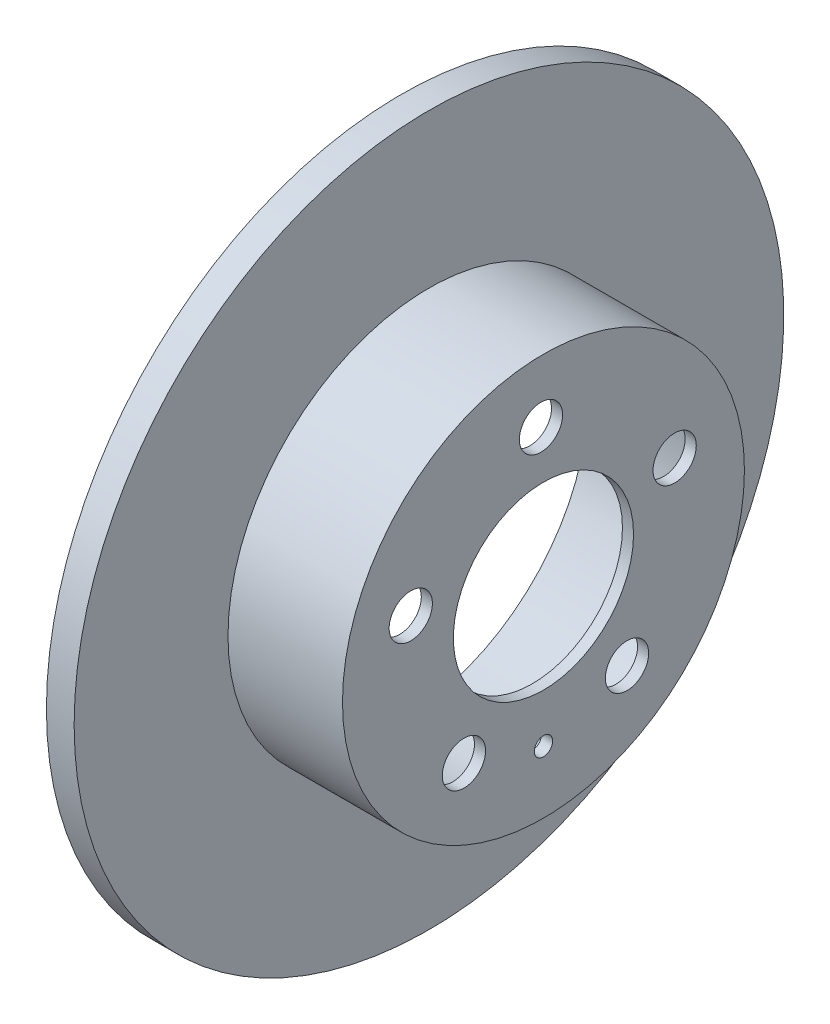
ISO-10303-21;
HEADER;
FILE_DESCRIPTION(('STEP AP214'),'2;1');
FILE_NAME('part.step','',(''),(''),'','','');
FILE_SCHEMA(('AUTOMOTIVE_DESIGN { 1 0 10303 214 1 1 1 1 }'));
ENDSEC;
DATA;
#1=APPLICATION_CONTEXT('core data for automotive mechanical design processes');
#2=APPLICATION_PROTOCOL_DEFINITION('international standard','automotive_design',2000,#1);
#3=PRODUCT_CONTEXT('',#1,'mechanical');
#4=PRODUCT('Part','Part','',(#3));
#5=PRODUCT_RELATED_PRODUCT_CATEGORY('part','',(#4));
#6=PRODUCT_DEFINITION_FORMATION('','',#4);
#7=PRODUCT_DEFINITION_CONTEXT('part definition',#1,'design');
#8=PRODUCT_DEFINITION('design','',#6,#7);
#9=PRODUCT_DEFINITION_SHAPE('','',#8);
#10=(LENGTH_UNIT() NAMED_UNIT(*) SI_UNIT(.MILLI.,.METRE.));
#11=(NAMED_UNIT(*) PLANE_ANGLE_UNIT() SI_UNIT($,.RADIAN.));
#12=(NAMED_UNIT(*) SI_UNIT($,.STERADIAN.) SOLID_ANGLE_UNIT());
#13=UNCERTAINTY_MEASURE_WITH_UNIT(LENGTH_MEASURE(1.E-05),#10,'distance_accuracy_value','');
#14=(GEOMETRIC_REPRESENTATION_CONTEXT(3) GLOBAL_UNCERTAINTY_ASSIGNED_CONTEXT((#13)) GLOBAL_UNIT_ASSIGNED_CONTEXT((#10,
#11,#12)) REPRESENTATION_CONTEXT('',''));
#15=CARTESIAN_POINT('',(0.,0.,0.));
#16=DIRECTION('',(0.,0.,1.));
#17=DIRECTION('',(1.,0.,0.));
#18=AXIS2_PLACEMENT_3D('',#15,#16,#17);
#19=CARTESIAN_POINT('',(0.,0.,0.));
#20=DIRECTION('',(1.,0.,0.));
#21=DIRECTION('',(0.,0.,-1.));
#22=AXIS2_PLACEMENT_3D('',#19,#20,#21);
#23=PLANE('',#22);
#24=CARTESIAN_POINT('',(0.,0.,0.));
#25=DIRECTION('',(-1.,0.,0.));
#26=DIRECTION('',(0.,0.,1.));
#27=AXIS2_PLACEMENT_3D('',#24,#25,#26);
#28=CIRCLE('',#27,67.5);
#29=CARTESIAN_POINT('',(0.,0.,67.5));
#30=VERTEX_POINT('',#29);
#31=EDGE_CURVE('E67',#30,#30,#28,.T.);
#32=ORIENTED_EDGE('',*,*,#31,.F.);
#33=EDGE_LOOP('',(#32));
#34=FACE_BOUND('',#33,.T.);
#35=CARTESIAN_POINT('',(0.,0.,0.));
#36=DIRECTION('',(-1.,0.,0.));
#37=DIRECTION('',(0.,0.,1.));
#38=AXIS2_PLACEMENT_3D('',#35,#36,#37);
#39=CIRCLE('',#38,128.);
#40=CARTESIAN_POINT('',(0.,0.,128.));
#41=VERTEX_POINT('',#40);
#42=EDGE_CURVE('E42',#41,#41,#39,.T.);
#43=ORIENTED_EDGE('',*,*,#42,.T.);
#44=EDGE_LOOP('',(#43));
#45=FACE_BOUND('',#44,.T.);
#46=ADVANCED_FACE('F39',(#34,#45),#23,.F.);
#47=CARTESIAN_POINT('',(0.,0.,0.));
#48=DIRECTION('',(-1.,0.,0.));
#49=DIRECTION('',(0.,0.,1.));
#50=AXIS2_PLACEMENT_3D('',#47,#48,#49);
#51=CYLINDRICAL_SURFACE('',#50,128.);
#52=ORIENTED_EDGE('',*,*,#42,.F.);
#53=EDGE_LOOP('',(#52));
#54=FACE_BOUND('',#53,.T.);
#55=CARTESIAN_POINT('',(9.99999999999998,0.,0.));
#56=DIRECTION('',(-1.,0.,0.));
#57=DIRECTION('',(0.,0.,1.));
#58=AXIS2_PLACEMENT_3D('',#55,#56,#57);
#59=CIRCLE('',#58,128.);
#60=CARTESIAN_POINT('',(9.99999999999998,0.,128.));
#61=VERTEX_POINT('',#60);
#62=EDGE_CURVE('E52',#61,#61,#59,.T.);
#63=ORIENTED_EDGE('',*,*,#62,.T.);
#64=EDGE_LOOP('',(#63));
#65=FACE_BOUND('',#64,.T.);
#66=ADVANCED_FACE('F171',(#54,#65),#51,.T.);
#67=CARTESIAN_POINT('',(9.99999999999999,0.,0.));
#68=DIRECTION('',(-1.,0.,0.));
#69=DIRECTION('',(0.,0.,1.));
#70=AXIS2_PLACEMENT_3D('',#67,#68,#69);
#71=PLANE('',#70);
#72=CARTESIAN_POINT('',(9.99999999999999,0.,0.));
#73=DIRECTION('',(1.,0.,0.));
#74=DIRECTION('',(0.,0.,-1.));
#75=AXIS2_PLACEMENT_3D('',#72,#73,#74);
#76=CIRCLE('',#75,72.5);
#77=CARTESIAN_POINT('',(9.99999999999999,0.,72.5));
#78=VERTEX_POINT('',#77);
#79=EDGE_CURVE('E11',#78,#78,#76,.T.);
#80=ORIENTED_EDGE('',*,*,#79,.F.);
#81=EDGE_LOOP('',(#80));
#82=FACE_BOUND('',#81,.T.);
#83=ORIENTED_EDGE('',*,*,#62,.F.);
#84=EDGE_LOOP('',(#83));
#85=FACE_BOUND('',#84,.T.);
#86=ADVANCED_FACE('F176',(#82,#85),#71,.F.);
#87=CARTESIAN_POINT('',(51.3,0.,0.));
#88=DIRECTION('',(-1.,0.,0.));
#89=DIRECTION('',(0.,0.,1.));
#90=AXIS2_PLACEMENT_3D('',#87,#88,#89);
#91=CYLINDRICAL_SURFACE('',#90,72.5);
#92=CARTESIAN_POINT('',(51.3,0.,0.));
#93=DIRECTION('',(1.,0.,0.));
#94=DIRECTION('',(0.,0.,-1.));
#95=AXIS2_PLACEMENT_3D('',#92,#93,#94);
#96=CIRCLE('',#95,72.5);
#97=CARTESIAN_POINT('',(51.3,0.,72.5));
#98=VERTEX_POINT('',#97);
#99=EDGE_CURVE('E54',#98,#98,#96,.T.);
#100=CARTESIAN_POINT('',(51.3,0.,72.5));
#101=CARTESIAN_POINT('',(50.8697916666666,0.,72.5));
#102=CARTESIAN_POINT('',(50.4395833333333,0.,72.5));
#103=CARTESIAN_POINT('',(49.5791666666666,0.,72.5));
#104=CARTESIAN_POINT('',(49.1489583333333,0.,72.5));
#105=CARTESIAN_POINT('',(48.2885416666667,0.,72.5));
#106=CARTESIAN_POINT('',(47.8583333333333,0.,72.5));
#107=CARTESIAN_POINT('',(46.9979166666666,0.,72.5));
#108=CARTESIAN_POINT('',(46.5677083333333,0.,72.5));
#109=CARTESIAN_POINT('',(45.7072916666666,0.,72.5));
#110=CARTESIAN_POINT('',(45.2770833333333,0.,72.5));
#111=CARTESIAN_POINT('',(44.4166666666666,0.,72.5));
#112=CARTESIAN_POINT('',(43.9864583333333,0.,72.5));
#113=CARTESIAN_POINT('',(43.1260416666667,0.,72.5));
#114=CARTESIAN_POINT('',(42.6958333333333,0.,72.5));
#115=CARTESIAN_POINT('',(41.8354166666667,0.,72.5));
#116=CARTESIAN_POINT('',(41.4052083333333,0.,72.5));
#117=CARTESIAN_POINT('',(40.5447916666666,0.,72.5));
#118=CARTESIAN_POINT('',(40.1145833333333,0.,72.5));
#119=CARTESIAN_POINT('',(39.2541666666666,0.,72.5));
#120=CARTESIAN_POINT('',(38.8239583333333,0.,72.5));
#121=CARTESIAN_POINT('',(37.9635416666667,0.,72.5));
#122=CARTESIAN_POINT('',(37.5333333333333,0.,72.5));
#123=CARTESIAN_POINT('',(36.6729166666667,0.,72.5));
#124=CARTESIAN_POINT('',(36.2427083333333,0.,72.5));
#125=CARTESIAN_POINT('',(35.3822916666666,0.,72.5));
#126=CARTESIAN_POINT('',(34.9520833333333,0.,72.5));
#127=CARTESIAN_POINT('',(34.0916666666667,0.,72.5));
#128=CARTESIAN_POINT('',(33.6614583333333,0.,72.5));
#129=CARTESIAN_POINT('',(32.8010416666667,0.,72.5));
#130=CARTESIAN_POINT('',(32.3708333333333,0.,72.5));
#131=CARTESIAN_POINT('',(31.5104166666667,0.,72.5));
#132=CARTESIAN_POINT('',(31.0802083333333,0.,72.5));
#133=CARTESIAN_POINT('',(30.2197916666667,0.,72.5));
#134=CARTESIAN_POINT('',(29.7895833333333,0.,72.5));
#135=CARTESIAN_POINT('',(28.9291666666667,0.,72.5));
#136=CARTESIAN_POINT('',(28.4989583333333,0.,72.5));
#137=CARTESIAN_POINT('',(27.6385416666667,0.,72.5));
#138=CARTESIAN_POINT('',(27.2083333333333,0.,72.5));
#139=CARTESIAN_POINT('',(26.3479166666667,0.,72.5));
#140=CARTESIAN_POINT('',(25.9177083333333,0.,72.5));
#141=CARTESIAN_POINT('',(25.0572916666667,0.,72.5));
#142=CARTESIAN_POINT('',(24.6270833333333,0.,72.5));
#143=CARTESIAN_POINT('',(23.7666666666667,0.,72.5));
#144=CARTESIAN_POINT('',(23.3364583333333,0.,72.5));
#145=CARTESIAN_POINT('',(22.4760416666666,0.,72.5));
#146=CARTESIAN_POINT('',(22.0458333333333,0.,72.5));
#147=CARTESIAN_POINT('',(21.1854166666667,0.,72.5));
#148=CARTESIAN_POINT('',(20.7552083333333,0.,72.5));
#149=CARTESIAN_POINT('',(19.8947916666667,0.,72.5));
#150=CARTESIAN_POINT('',(19.4645833333333,0.,72.5));
#151=CARTESIAN_POINT('',(18.6041666666667,0.,72.5));
#152=CARTESIAN_POINT('',(18.1739583333333,0.,72.5));
#153=CARTESIAN_POINT('',(17.3135416666667,0.,72.5));
#154=CARTESIAN_POINT('',(16.8833333333333,0.,72.5));
#155=CARTESIAN_POINT('',(16.0229166666667,0.,72.5));
#156=CARTESIAN_POINT('',(15.5927083333333,0.,72.5));
#157=CARTESIAN_POINT('',(14.7322916666667,0.,72.5));
#158=CARTESIAN_POINT('',(14.3020833333333,0.,72.5));
#159=CARTESIAN_POINT('',(13.4416666666667,0.,72.5));
#160=CARTESIAN_POINT('',(13.0114583333333,0.,72.5));
#161=CARTESIAN_POINT('',(12.1510416666667,0.,72.5));
#162=CARTESIAN_POINT('',(11.7208333333333,0.,72.5));
#163=CARTESIAN_POINT('',(10.8604166666667,0.,72.5));
#164=CARTESIAN_POINT('',(10.4302083333333,0.,72.5));
#165=CARTESIAN_POINT('',(9.99999999999999,0.,72.5));
#166=B_SPLINE_CURVE_WITH_KNOTS('',3,(#100,#101,#102,#103,#104,#105,#106,#107,#108,#109,#110,
#111,#112,#113,#114,#115,#116,#117,#118,#119,#120,#121,#122,#123,#124,#125,#126,#127,#128,#129,
#130,#131,#132,#133,#134,#135,#136,#137,#138,#139,#140,#141,#142,#143,#144,#145,#146,#147,#148,
#149,#150,#151,#152,#153,#154,#155,#156,#157,#158,#159,#160,#161,#162,#163,#164,#165),
.UNSPECIFIED.,.F.,.F.,(4,2,2,2,2,2,2,2,2,2,2,2,2,2,2,2,2,2,2,2,2,2,2,2,2,2,2,2,2,2,2,2,4),(0.,
1.290625,2.58124999999999,3.871875,5.16249999999999,6.453125,7.74374999999999,9.03437499999999,
10.325,11.615625,12.90625,14.196875,15.4875,16.778125,18.06875,19.359375,20.65,21.940625,
23.23125,24.521875,25.8125,27.103125,28.39375,29.684375,30.975,32.265625,33.55625,34.846875,
36.1375,37.428125,38.71875,40.009375,41.3),.UNSPECIFIED.);
#167=EDGE_CURVE('BSEAM138',#98,#78,#166,.T.);
#168=ORIENTED_EDGE('',*,*,#99,.F.);
#169=ORIENTED_EDGE('',*,*,#79,.T.);
#170=ORIENTED_EDGE('',*,*,#167,.T.);
#171=ORIENTED_EDGE('',*,*,#167,.F.);
#172=EDGE_LOOP('',(#168,#170,#169,#171));
#173=FACE_BOUND('',#172,.T.);
#174=ADVANCED_FACE('F138',(#173),#91,.T.);
#175=CARTESIAN_POINT('',(51.3,0.,0.));
#176=DIRECTION('',(1.,0.,0.));
#177=DIRECTION('',(0.,0.,-1.));
#178=AXIS2_PLACEMENT_3D('',#175,#176,#177);
#179=PLANE('',#178);
#180=CARTESIAN_POINT('',(51.3,16.3781218144965,-47.3273365761536));
#181=DIRECTION('',(1.,0.,0.));
#182=DIRECTION('',(0.,0.,-1.));
#183=AXIS2_PLACEMENT_3D('',#180,#181,#182);
#184=CIRCLE('',#183,7.80000000002723);
#185=CARTESIAN_POINT('',(51.3,16.3781218144965,-55.1273365761809));
#186=VERTEX_POINT('',#185);
#187=EDGE_CURVE('E120',#186,#186,#184,.T.);
#188=ORIENTED_EDGE('',*,*,#187,.F.);
#189=EDGE_LOOP('',(#188));
#190=FACE_BOUND('',#189,.T.);
#191=CARTESIAN_POINT('',(51.3,-39.9006432883815,-30.1498144229523));
#192=DIRECTION('',(1.,0.,0.));
#193=DIRECTION('',(0.,0.,-1.));
#194=AXIS2_PLACEMENT_3D('',#191,#192,#193);
#195=CIRCLE('',#194,7.79999999998488);
#196=CARTESIAN_POINT('',(51.3,-39.9006432883815,-37.9498144229371));
#197=VERTEX_POINT('',#196);
#198=EDGE_CURVE('E112',#197,#197,#195,.T.);
#199=ORIENTED_EDGE('',*,*,#198,.F.);
#200=EDGE_LOOP('',(#199));
#201=FACE_BOUND('',#200,.T.);
#202=CARTESIAN_POINT('',(51.3,-50.,0.));
#203=DIRECTION('',(1.,0.,0.));
#204=DIRECTION('',(0.,0.,-1.));
#205=AXIS2_PLACEMENT_3D('',#202,#203,#204);
#206=CIRCLE('',#205,3.3);
#207=CARTESIAN_POINT('',(51.3,-50.,-3.3));
#208=VERTEX_POINT('',#207);
#209=EDGE_CURVE('E104',#208,#208,#206,.T.);
#210=ORIENTED_EDGE('',*,*,#209,.F.);
#211=EDGE_LOOP('',(#210));
#212=FACE_BOUND('',#211,.T.);
#213=CARTESIAN_POINT('',(51.3,-40.95494375,28.6826181237755));
#214=DIRECTION('',(1.,0.,0.));
#215=DIRECTION('',(0.,0.,-1.));
#216=AXIS2_PLACEMENT_3D('',#213,#214,#215);
#217=CIRCLE('',#216,7.8);
#218=CARTESIAN_POINT('',(51.3,-40.95494375,20.8826181237755));
#219=VERTEX_POINT('',#218);
#220=EDGE_CURVE('E96',#219,#219,#217,.T.);
#221=ORIENTED_EDGE('',*,*,#220,.F.);
#222=EDGE_LOOP('',(#221));
#223=FACE_BOUND('',#222,.T.);
#224=CARTESIAN_POINT('',(51.3,14.672227833243,47.8655389252874));
#225=DIRECTION('',(1.,0.,0.));
#226=DIRECTION('',(0.,0.,-1.));
#227=AXIS2_PLACEMENT_3D('',#224,#225,#226);
#228=CIRCLE('',#227,7.80000000005169);
#229=CARTESIAN_POINT('',(51.3,14.672227833243,40.0655389252357));
#230=VERTEX_POINT('',#229);
#231=EDGE_CURVE('E87',#230,#230,#228,.T.);
#232=ORIENTED_EDGE('',*,*,#231,.F.);
#233=EDGE_LOOP('',(#232));
#234=FACE_BOUND('',#233,.T.);
#235=CARTESIAN_POINT('',(51.3,50.1060110313281,0.888803437391398));
#236=DIRECTION('',(1.,0.,0.));
#237=DIRECTION('',(0.,0.,-1.));
#238=AXIS2_PLACEMENT_3D('',#235,#236,#237);
#239=CIRCLE('',#238,7.80000000006853);
#240=CARTESIAN_POINT('',(51.3,50.1060110313281,-6.91119656267713));
#241=VERTEX_POINT('',#240);
#242=EDGE_CURVE('E88',#241,#241,#239,.T.);
#243=ORIENTED_EDGE('',*,*,#242,.F.);
#244=EDGE_LOOP('',(#243));
#245=FACE_BOUND('',#244,.T.);
#246=CARTESIAN_POINT('',(51.3,0.,0.));
#247=DIRECTION('',(1.,0.,0.));
#248=DIRECTION('',(0.,0.,-1.));
#249=AXIS2_PLACEMENT_3D('',#246,#247,#248);
#250=CIRCLE('',#249,32.5);
#251=CARTESIAN_POINT('',(51.3,0.,-32.5));
#252=VERTEX_POINT('',#251);
#253=EDGE_CURVE('E78',#252,#252,#250,.T.);
#254=ORIENTED_EDGE('',*,*,#253,.F.);
#255=EDGE_LOOP('',(#254));
#256=FACE_BOUND('',#255,.T.);
#257=ORIENTED_EDGE('',*,*,#99,.T.);
#258=EDGE_LOOP('',(#257));
#259=FACE_BOUND('',#258,.T.);
#260=ADVANCED_FACE('F134',(#190,#201,#212,#223,#234,#245,#256,#259),#179,.T.);
#261=CARTESIAN_POINT('',(47.3,0.,0.));
#262=DIRECTION('',(1.,0.,0.));
#263=DIRECTION('',(0.,0.,-1.));
#264=AXIS2_PLACEMENT_3D('',#261,#262,#263);
#265=PLANE('',#264);
#266=CARTESIAN_POINT('',(47.3,16.3781218144965,-47.3273365761536));
#267=DIRECTION('',(1.,0.,0.));
#268=DIRECTION('',(0.,0.,-1.));
#269=AXIS2_PLACEMENT_3D('',#266,#267,#268);
#270=CIRCLE('',#269,7.80000000002723);
#271=CARTESIAN_POINT('',(47.3,16.3781218144965,-55.1273365761809));
#272=VERTEX_POINT('',#271);
#273=EDGE_CURVE('E82',#272,#272,#270,.F.);
#274=ORIENTED_EDGE('',*,*,#273,.F.);
#275=EDGE_LOOP('',(#274));
#276=FACE_BOUND('',#275,.T.);
#277=CARTESIAN_POINT('',(47.3,-39.9006432883815,-30.1498144229523));
#278=DIRECTION('',(1.,0.,0.));
#279=DIRECTION('',(0.,0.,-1.));
#280=AXIS2_PLACEMENT_3D('',#277,#278,#279);
#281=CIRCLE('',#280,7.79999999998488);
#282=CARTESIAN_POINT('',(47.3,-39.9006432883815,-37.9498144229371));
#283=VERTEX_POINT('',#282);
#284=EDGE_CURVE('E116',#283,#283,#281,.F.);
#285=ORIENTED_EDGE('',*,*,#284,.F.);
#286=EDGE_LOOP('',(#285));
#287=FACE_BOUND('',#286,.T.);
#288=CARTESIAN_POINT('',(47.3,-50.,0.));
#289=DIRECTION('',(1.,0.,0.));
#290=DIRECTION('',(0.,0.,-1.));
#291=AXIS2_PLACEMENT_3D('',#288,#289,#290);
#292=CIRCLE('',#291,3.3);
#293=CARTESIAN_POINT('',(47.3,-50.,-3.3));
#294=VERTEX_POINT('',#293);
#295=EDGE_CURVE('E108',#294,#294,#292,.F.);
#296=ORIENTED_EDGE('',*,*,#295,.F.);
#297=EDGE_LOOP('',(#296));
#298=FACE_BOUND('',#297,.T.);
#299=CARTESIAN_POINT('',(47.3,-40.95494375,28.6826181237755));
#300=DIRECTION('',(1.,0.,0.));
#301=DIRECTION('',(0.,0.,-1.));
#302=AXIS2_PLACEMENT_3D('',#299,#300,#301);
#303=CIRCLE('',#302,7.8);
#304=CARTESIAN_POINT('',(47.3,-40.95494375,20.8826181237755));
#305=VERTEX_POINT('',#304);
#306=EDGE_CURVE('E100',#305,#305,#303,.F.);
#307=ORIENTED_EDGE('',*,*,#306,.F.);
#308=EDGE_LOOP('',(#307));
#309=FACE_BOUND('',#308,.T.);
#310=CARTESIAN_POINT('',(47.3,14.672227833243,47.8655389252874));
#311=DIRECTION('',(1.,0.,0.));
#312=DIRECTION('',(0.,0.,-1.));
#313=AXIS2_PLACEMENT_3D('',#310,#311,#312);
#314=CIRCLE('',#313,7.80000000005169);
#315=CARTESIAN_POINT('',(47.3,14.672227833243,40.0655389252357));
#316=VERTEX_POINT('',#315);
#317=EDGE_CURVE('E92',#316,#316,#314,.F.);
#318=ORIENTED_EDGE('',*,*,#317,.F.);
#319=EDGE_LOOP('',(#318));
#320=FACE_BOUND('',#319,.T.);
#321=CARTESIAN_POINT('',(47.3,50.1060110313281,0.888803437391398));
#322=DIRECTION('',(1.,0.,0.));
#323=DIRECTION('',(0.,0.,-1.));
#324=AXIS2_PLACEMENT_3D('',#321,#322,#323);
#325=CIRCLE('',#324,7.80000000006853);
#326=CARTESIAN_POINT('',(47.3,50.1060110313281,-6.91119656267713));
#327=VERTEX_POINT('',#326);
#328=EDGE_CURVE('E83',#327,#327,#325,.F.);
#329=ORIENTED_EDGE('',*,*,#328,.F.);
#330=EDGE_LOOP('',(#329));
#331=FACE_BOUND('',#330,.T.);
#332=CARTESIAN_POINT('',(47.3,0.,0.));
#333=DIRECTION('',(1.,0.,0.));
#334=DIRECTION('',(0.,0.,-1.));
#335=AXIS2_PLACEMENT_3D('',#332,#333,#334);
#336=CIRCLE('',#335,32.5);
#337=CARTESIAN_POINT('',(47.3,0.,-32.5));
#338=VERTEX_POINT('',#337);
#339=EDGE_CURVE('E72',#338,#338,#336,.F.);
#340=ORIENTED_EDGE('',*,*,#339,.F.);
#341=EDGE_LOOP('',(#340));
#342=FACE_BOUND('',#341,.T.);
#343=CARTESIAN_POINT('',(47.3,0.,0.));
#344=DIRECTION('',(1.,0.,0.));
#345=DIRECTION('',(0.,0.,-1.));
#346=AXIS2_PLACEMENT_3D('',#343,#344,#345);
#347=CIRCLE('',#346,67.5);
#348=CARTESIAN_POINT('',(47.3,0.,-67.5));
#349=VERTEX_POINT('',#348);
#350=EDGE_CURVE('E62',#349,#349,#347,.F.);
#351=ORIENTED_EDGE('',*,*,#350,.T.);
#352=EDGE_LOOP('',(#351));
#353=FACE_BOUND('',#352,.T.);
#354=ADVANCED_FACE('F137',(#276,#287,#298,#309,#320,#331,#342,#353),#265,.F.);
#355=CARTESIAN_POINT('',(242.218830920368,0.,0.));
#356=DIRECTION('',(-1.,0.,0.));
#357=DIRECTION('',(0.,0.,1.));
#358=AXIS2_PLACEMENT_3D('',#355,#356,#357);
#359=CYLINDRICAL_SURFACE('',#358,67.5);
#360=ORIENTED_EDGE('',*,*,#31,.T.);
#361=EDGE_LOOP('',(#360));
#362=FACE_BOUND('',#361,.T.);
#363=ORIENTED_EDGE('',*,*,#350,.F.);
#364=EDGE_LOOP('',(#363));
#365=FACE_BOUND('',#364,.T.);
#366=ADVANCED_FACE('F156',(#362,#365),#359,.F.);
#367=CARTESIAN_POINT('',(-0.00100000000002876,0.,0.));
#368=DIRECTION('',(1.,0.,0.));
#369=DIRECTION('',(0.,0.,-1.));
#370=AXIS2_PLACEMENT_3D('',#367,#368,#369);
#371=CYLINDRICAL_SURFACE('',#370,32.5);
#372=ORIENTED_EDGE('',*,*,#253,.T.);
#373=EDGE_LOOP('',(#372));
#374=FACE_BOUND('',#373,.T.);
#375=ORIENTED_EDGE('',*,*,#339,.T.);
#376=EDGE_LOOP('',(#375));
#377=FACE_BOUND('',#376,.T.);
#378=ADVANCED_FACE('F152',(#374,#377),#371,.F.);
#379=CARTESIAN_POINT('',(-0.00100000000002876,50.1060110313281,0.888803437391398));
#380=DIRECTION('',(1.,0.,0.));
#381=DIRECTION('',(0.,0.,-1.));
#382=AXIS2_PLACEMENT_3D('',#379,#380,#381);
#383=CYLINDRICAL_SURFACE('',#382,7.80000000006853);
#384=ORIENTED_EDGE('',*,*,#242,.T.);
#385=EDGE_LOOP('',(#384));
#386=FACE_BOUND('',#385,.T.);
#387=ORIENTED_EDGE('',*,*,#328,.T.);
#388=EDGE_LOOP('',(#387));
#389=FACE_BOUND('',#388,.T.);
#390=ADVANCED_FACE('F155',(#386,#389),#383,.F.);
#391=CARTESIAN_POINT('',(-0.00100000000002876,14.672227833243,47.8655389252874));
#392=DIRECTION('',(1.,0.,0.));
#393=DIRECTION('',(0.,0.,-1.));
#394=AXIS2_PLACEMENT_3D('',#391,#392,#393);
#395=CYLINDRICAL_SURFACE('',#394,7.80000000005169);
#396=ORIENTED_EDGE('',*,*,#231,.T.);
#397=EDGE_LOOP('',(#396));
#398=FACE_BOUND('',#397,.T.);
#399=ORIENTED_EDGE('',*,*,#317,.T.);
#400=EDGE_LOOP('',(#399));
#401=FACE_BOUND('',#400,.T.);
#402=ADVANCED_FACE('F216',(#398,#401),#395,.F.);
#403=CARTESIAN_POINT('',(-0.00100000000002876,-40.95494375,28.6826181237755));
#404=DIRECTION('',(1.,0.,0.));
#405=DIRECTION('',(0.,0.,-1.));
#406=AXIS2_PLACEMENT_3D('',#403,#404,#405);
#407=CYLINDRICAL_SURFACE('',#406,7.8);
#408=ORIENTED_EDGE('',*,*,#220,.T.);
#409=EDGE_LOOP('',(#408));
#410=FACE_BOUND('',#409,.T.);
#411=ORIENTED_EDGE('',*,*,#306,.T.);
#412=EDGE_LOOP('',(#411));
#413=FACE_BOUND('',#412,.T.);
#414=ADVANCED_FACE('F226',(#410,#413),#407,.F.);
#415=CARTESIAN_POINT('',(-0.00100000000002876,-50.,0.));
#416=DIRECTION('',(1.,0.,0.));
#417=DIRECTION('',(0.,0.,-1.));
#418=AXIS2_PLACEMENT_3D('',#415,#416,#417);
#419=CYLINDRICAL_SURFACE('',#418,3.3);
#420=ORIENTED_EDGE('',*,*,#209,.T.);
#421=EDGE_LOOP('',(#420));
#422=FACE_BOUND('',#421,.T.);
#423=ORIENTED_EDGE('',*,*,#295,.T.);
#424=EDGE_LOOP('',(#423));
#425=FACE_BOUND('',#424,.T.);
#426=ADVANCED_FACE('F236',(#422,#425),#419,.F.);
#427=CARTESIAN_POINT('',(-0.00100000000002876,-39.9006432883815,-30.1498144229523));
#428=DIRECTION('',(1.,0.,0.));
#429=DIRECTION('',(0.,0.,-1.));
#430=AXIS2_PLACEMENT_3D('',#427,#428,#429);
#431=CYLINDRICAL_SURFACE('',#430,7.79999999998488);
#432=ORIENTED_EDGE('',*,*,#198,.T.);
#433=EDGE_LOOP('',(#432));
#434=FACE_BOUND('',#433,.T.);
#435=ORIENTED_EDGE('',*,*,#284,.T.);
#436=EDGE_LOOP('',(#435));
#437=FACE_BOUND('',#436,.T.);
#438=ADVANCED_FACE('F246',(#434,#437),#431,.F.);
#439=CARTESIAN_POINT('',(-0.00100000000002876,16.3781218144965,-47.3273365761536));
#440=DIRECTION('',(1.,0.,0.));
#441=DIRECTION('',(0.,0.,-1.));
#442=AXIS2_PLACEMENT_3D('',#439,#440,#441);
#443=CYLINDRICAL_SURFACE('',#442,7.80000000002723);
#444=ORIENTED_EDGE('',*,*,#187,.T.);
#445=EDGE_LOOP('',(#444));
#446=FACE_BOUND('',#445,.T.);
#447=ORIENTED_EDGE('',*,*,#273,.T.);
#448=EDGE_LOOP('',(#447));
#449=FACE_BOUND('',#448,.T.);
#450=ADVANCED_FACE('F131',(#446,#449),#443,.F.);
#451=CLOSED_SHELL('',(#46,#66,#86,#174,#260,#354,#366,#378,#390,#402,#414,#426,#438,#450));
#452=MANIFOLD_SOLID_BREP('B2',#451);
#453=ADVANCED_BREP_SHAPE_REPRESENTATION('',(#18,#452),#14);
#454=SHAPE_DEFINITION_REPRESENTATION(#9,#453);
ENDSEC;
END-ISO-10303-21;
